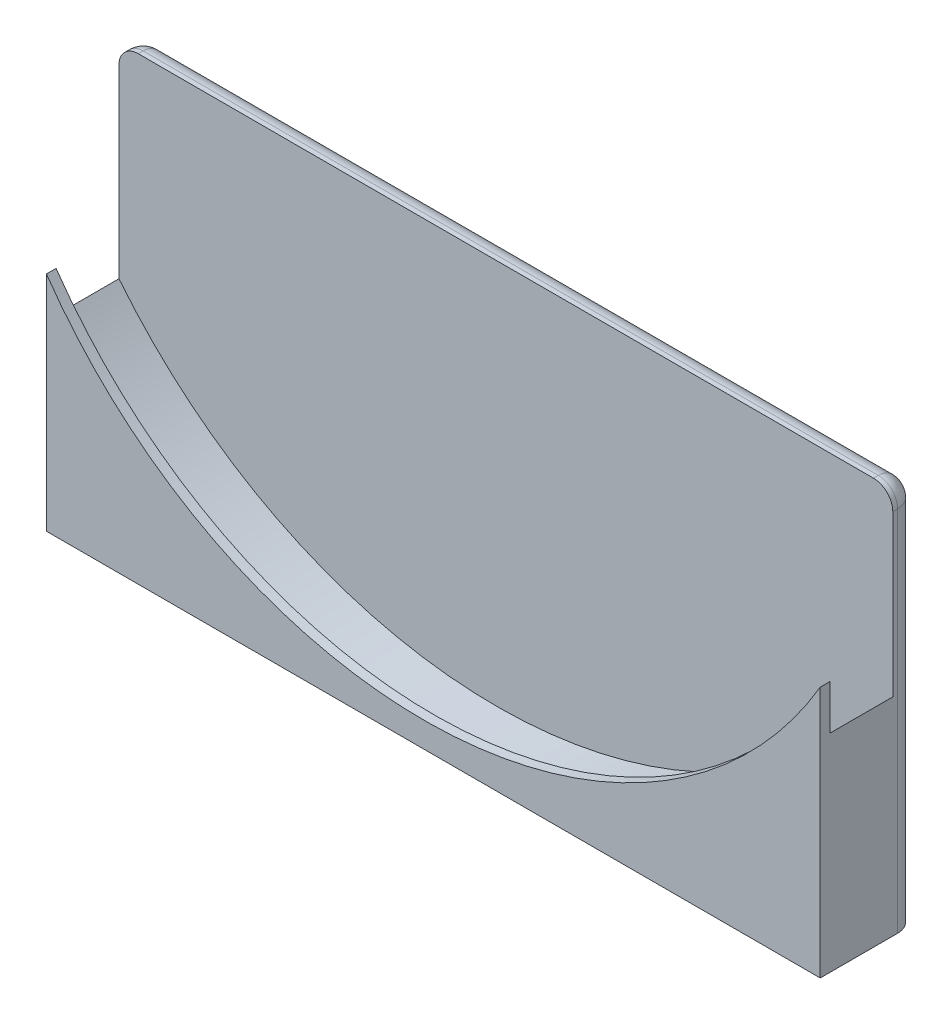
ISO-10303-21;
HEADER;
FILE_DESCRIPTION(('STEP AP214'),'2;1');
FILE_NAME('part.step','',(''),(''),'','','');
FILE_SCHEMA(('AUTOMOTIVE_DESIGN { 1 0 10303 214 1 1 1 1 }'));
ENDSEC;
DATA;
#1=APPLICATION_CONTEXT('core data for automotive mechanical design processes');
#2=APPLICATION_PROTOCOL_DEFINITION('international standard','automotive_design',2000,#1);
#3=PRODUCT_CONTEXT('',#1,'mechanical');
#4=PRODUCT('Part','Part','',(#3));
#5=PRODUCT_RELATED_PRODUCT_CATEGORY('part','',(#4));
#6=PRODUCT_DEFINITION_FORMATION('','',#4);
#7=PRODUCT_DEFINITION_CONTEXT('part definition',#1,'design');
#8=PRODUCT_DEFINITION('design','',#6,#7);
#9=PRODUCT_DEFINITION_SHAPE('','',#8);
#10=(LENGTH_UNIT() NAMED_UNIT(*) SI_UNIT(.MILLI.,.METRE.));
#11=(NAMED_UNIT(*) PLANE_ANGLE_UNIT() SI_UNIT($,.RADIAN.));
#12=(NAMED_UNIT(*) SI_UNIT($,.STERADIAN.) SOLID_ANGLE_UNIT());
#13=UNCERTAINTY_MEASURE_WITH_UNIT(LENGTH_MEASURE(1.E-05),#10,'distance_accuracy_value','');
#14=(GEOMETRIC_REPRESENTATION_CONTEXT(3) GLOBAL_UNCERTAINTY_ASSIGNED_CONTEXT((#13)) GLOBAL_UNIT_ASSIGNED_CONTEXT((#10,
#11,#12)) REPRESENTATION_CONTEXT('',''));
#15=CARTESIAN_POINT('',(0.,0.,0.));
#16=DIRECTION('',(0.,0.,1.));
#17=DIRECTION('',(1.,0.,0.));
#18=AXIS2_PLACEMENT_3D('',#15,#16,#17);
#19=CARTESIAN_POINT('',(0.,40.,0.));
#20=DIRECTION('',(0.,1.,0.));
#21=DIRECTION('',(0.,0.,1.));
#22=AXIS2_PLACEMENT_3D('',#19,#20,#21);
#23=PLANE('',#22);
#24=DIRECTION('',(0.,0.,-1.));
#25=VECTOR('',#24,1.);
#26=CARTESIAN_POINT('',(35.3343488695988,40.,2.06444673782802));
#27=LINE('',#26,#25);
#28=CARTESIAN_POINT('',(35.3343488695988,40.,4.56444673782803));
#29=VERTEX_POINT('',#28);
#30=CARTESIAN_POINT('',(35.3343488695988,40.,4.06444673782802));
#31=VERTEX_POINT('',#30);
#32=EDGE_CURVE('E188',#29,#31,#27,.T.);
#33=ORIENTED_EDGE('',*,*,#32,.T.);
#34=DIRECTION('',(-1.,0.,0.));
#35=VECTOR('',#34,1.);
#36=CARTESIAN_POINT('',(-40.6656511304012,40.,4.06444673782803));
#37=LINE('',#36,#35);
#38=CARTESIAN_POINT('',(-40.6656511304012,40.,4.06444673782803));
#39=VERTEX_POINT('',#38);
#40=EDGE_CURVE('E213',#31,#39,#37,.T.);
#41=ORIENTED_EDGE('',*,*,#40,.T.);
#42=DIRECTION('',(0.,0.,1.));
#43=VECTOR('',#42,1.);
#44=CARTESIAN_POINT('',(-40.6656511304012,40.,4.56444673782803));
#45=LINE('',#44,#43);
#46=CARTESIAN_POINT('',(-40.6656511304012,40.,4.56444673782803));
#47=VERTEX_POINT('',#46);
#48=EDGE_CURVE('E186',#39,#47,#45,.T.);
#49=ORIENTED_EDGE('',*,*,#48,.T.);
#50=DIRECTION('',(1.,0.,0.));
#51=VECTOR('',#50,1.);
#52=CARTESIAN_POINT('',(0.,40.,4.56444673782803));
#53=LINE('',#52,#51);
#54=EDGE_CURVE('E178',#47,#29,#53,.T.);
#55=ORIENTED_EDGE('',*,*,#54,.T.);
#56=EDGE_LOOP('',(#33,#41,#49,#55));
#57=FACE_BOUND('',#56,.T.);
#58=ADVANCED_FACE('F35',(#57),#23,.T.);
#59=CARTESIAN_POINT('',(37.3343488695988,40.,12.064446737828));
#60=DIRECTION('',(-1.,0.,0.));
#61=DIRECTION('',(0.,0.,1.));
#62=AXIS2_PLACEMENT_3D('',#59,#60,#61);
#63=PLANE('',#62);
#64=DIRECTION('',(0.,0.,-1.));
#65=VECTOR('',#64,1.);
#66=CARTESIAN_POINT('',(37.3343488695988,0.,12.064446737828));
#67=LINE('',#66,#65);
#68=CARTESIAN_POINT('',(37.3343488695988,0.,12.064446737828));
#69=VERTEX_POINT('',#68);
#70=CARTESIAN_POINT('',(37.3343488695988,0.,4.06444673782802));
#71=VERTEX_POINT('',#70);
#72=EDGE_CURVE('E163',#69,#71,#67,.T.);
#73=ORIENTED_EDGE('',*,*,#72,.T.);
#74=DIRECTION('',(0.,-1.,0.));
#75=VECTOR('',#74,1.);
#76=CARTESIAN_POINT('',(37.3343488695988,40.,4.06444673782802));
#77=LINE('',#76,#75);
#78=CARTESIAN_POINT('',(37.3343488695988,38.,4.06444673782802));
#79=VERTEX_POINT('',#78);
#80=EDGE_CURVE('E11',#71,#79,#77,.F.);
#81=ORIENTED_EDGE('',*,*,#80,.T.);
#82=DIRECTION('',(0.,0.,-1.));
#83=VECTOR('',#82,1.);
#84=CARTESIAN_POINT('',(37.3343488695988,38.,4.56444673782803));
#85=LINE('',#84,#83);
#86=CARTESIAN_POINT('',(37.3343488695988,38.,4.56444673782803));
#87=VERTEX_POINT('',#86);
#88=EDGE_CURVE('E129',#79,#87,#85,.F.);
#89=ORIENTED_EDGE('',*,*,#88,.T.);
#90=DIRECTION('',(0.,1.,0.));
#91=VECTOR('',#90,1.);
#92=CARTESIAN_POINT('',(37.3343488695988,40.,4.56444673782803));
#93=LINE('',#92,#91);
#94=CARTESIAN_POINT('',(37.3343488695988,21.4175759211361,4.56444673782802));
#95=VERTEX_POINT('',#94);
#96=EDGE_CURVE('E124',#95,#87,#93,.T.);
#97=ORIENTED_EDGE('',*,*,#96,.F.);
#98=DIRECTION('',(0.,0.,1.));
#99=VECTOR('',#98,1.);
#100=CARTESIAN_POINT('',(37.3343488695988,21.4175759211361,-136.856909499481));
#101=LINE('',#100,#99);
#102=CARTESIAN_POINT('',(37.3343488695988,21.4175759211361,11.064446737828));
#103=VERTEX_POINT('',#102);
#104=EDGE_CURVE('E128',#95,#103,#101,.T.);
#105=ORIENTED_EDGE('',*,*,#104,.T.);
#106=DIRECTION('',(0.,1.,0.));
#107=VECTOR('',#106,1.);
#108=CARTESIAN_POINT('',(37.3343488695988,40.,11.064446737828));
#109=LINE('',#108,#107);
#110=CARTESIAN_POINT('',(37.3343488695988,26.0401927177059,11.064446737828));
#111=VERTEX_POINT('',#110);
#112=EDGE_CURVE('E145',#103,#111,#109,.T.);
#113=ORIENTED_EDGE('',*,*,#112,.T.);
#114=DIRECTION('',(0.,0.,1.));
#115=VECTOR('',#114,1.);
#116=CARTESIAN_POINT('',(37.3343488695988,26.0401927177059,4.56444673782803));
#117=LINE('',#116,#115);
#118=CARTESIAN_POINT('',(37.3343488695988,26.0401927177059,12.064446737828));
#119=VERTEX_POINT('',#118);
#120=EDGE_CURVE('E161',#111,#119,#117,.T.);
#121=ORIENTED_EDGE('',*,*,#120,.T.);
#122=DIRECTION('',(0.,-1.,0.));
#123=VECTOR('',#122,1.);
#124=CARTESIAN_POINT('',(37.3343488695988,40.,12.064446737828));
#125=LINE('',#124,#123);
#126=EDGE_CURVE('E173',#119,#69,#125,.T.);
#127=ORIENTED_EDGE('',*,*,#126,.T.);
#128=EDGE_LOOP('',(#73,#81,#89,#97,#105,#113,#121,#127));
#129=FACE_BOUND('',#128,.T.);
#130=ADVANCED_FACE('F126',(#129),#63,.F.);
#131=CARTESIAN_POINT('',(37.3343488695988,40.,2.06444673782802));
#132=DIRECTION('',(0.,0.,1.));
#133=DIRECTION('',(1.,0.,0.));
#134=AXIS2_PLACEMENT_3D('',#131,#132,#133);
#135=PLANE('',#134);
#136=DIRECTION('',(-1.,0.,0.));
#137=VECTOR('',#136,1.);
#138=CARTESIAN_POINT('',(37.3343488695988,0.,2.06444673782802));
#139=LINE('',#138,#137);
#140=CARTESIAN_POINT('',(35.3343488695988,0.,2.06444673782802));
#141=VERTEX_POINT('',#140);
#142=CARTESIAN_POINT('',(-40.6656511304012,0.,2.06444673782803));
#143=VERTEX_POINT('',#142);
#144=EDGE_CURVE('E165',#141,#143,#139,.T.);
#145=ORIENTED_EDGE('',*,*,#144,.T.);
#146=DIRECTION('',(0.,-1.,0.));
#147=VECTOR('',#146,1.);
#148=CARTESIAN_POINT('',(-40.6656511304012,40.,2.06444673782803));
#149=LINE('',#148,#147);
#150=CARTESIAN_POINT('',(-40.6656511304012,38.,2.06444673782803));
#151=VERTEX_POINT('',#150);
#152=EDGE_CURVE('E209',#143,#151,#149,.F.);
#153=ORIENTED_EDGE('',*,*,#152,.T.);
#154=DIRECTION('',(-1.,0.,0.));
#155=VECTOR('',#154,1.);
#156=CARTESIAN_POINT('',(35.3343488695988,38.,2.06444673782802));
#157=LINE('',#156,#155);
#158=CARTESIAN_POINT('',(35.3343488695988,38.,2.06444673782802));
#159=VERTEX_POINT('',#158);
#160=EDGE_CURVE('E207',#151,#159,#157,.F.);
#161=ORIENTED_EDGE('',*,*,#160,.T.);
#162=DIRECTION('',(0.,-1.,0.));
#163=VECTOR('',#162,1.);
#164=CARTESIAN_POINT('',(35.3343488695988,40.,2.06444673782802));
#165=LINE('',#164,#163);
#166=EDGE_CURVE('E205',#159,#141,#165,.T.);
#167=ORIENTED_EDGE('',*,*,#166,.T.);
#168=EDGE_LOOP('',(#145,#153,#161,#167));
#169=FACE_BOUND('',#168,.T.);
#170=ADVANCED_FACE('F236',(#169),#135,.F.);
#171=CARTESIAN_POINT('',(-42.6656511304012,40.,12.064446737828));
#172=DIRECTION('',(1.,0.,0.));
#173=DIRECTION('',(0.,0.,-1.));
#174=AXIS2_PLACEMENT_3D('',#171,#172,#173);
#175=PLANE('',#174);
#176=DIRECTION('',(0.,0.,1.));
#177=VECTOR('',#176,1.);
#178=CARTESIAN_POINT('',(-42.6656511304012,38.,2.06444673782803));
#179=LINE('',#178,#177);
#180=CARTESIAN_POINT('',(-42.6656511304012,38.,4.56444673782803));
#181=VERTEX_POINT('',#180);
#182=CARTESIAN_POINT('',(-42.6656511304012,38.,4.06444673782803));
#183=VERTEX_POINT('',#182);
#184=EDGE_CURVE('E195',#181,#183,#179,.F.);
#185=ORIENTED_EDGE('',*,*,#184,.T.);
#186=DIRECTION('',(0.,-1.,0.));
#187=VECTOR('',#186,1.);
#188=CARTESIAN_POINT('',(-42.6656511304012,40.,4.06444673782803));
#189=LINE('',#188,#187);
#190=CARTESIAN_POINT('',(-42.6656511304012,0.,4.06444673782803));
#191=VERTEX_POINT('',#190);
#192=EDGE_CURVE('E198',#183,#191,#189,.T.);
#193=ORIENTED_EDGE('',*,*,#192,.T.);
#194=DIRECTION('',(0.,0.,1.));
#195=VECTOR('',#194,1.);
#196=CARTESIAN_POINT('',(-42.6656511304012,0.,12.064446737828));
#197=LINE('',#196,#195);
#198=CARTESIAN_POINT('',(-42.6656511304012,0.,12.064446737828));
#199=VERTEX_POINT('',#198);
#200=EDGE_CURVE('E168',#191,#199,#197,.T.);
#201=ORIENTED_EDGE('',*,*,#200,.T.);
#202=DIRECTION('',(0.,-1.,0.));
#203=VECTOR('',#202,1.);
#204=CARTESIAN_POINT('',(-42.6656511304012,40.,12.064446737828));
#205=LINE('',#204,#203);
#206=CARTESIAN_POINT('',(-42.6656511304012,23.0368066253289,12.064446737828));
#207=VERTEX_POINT('',#206);
#208=EDGE_CURVE('E175',#207,#199,#205,.T.);
#209=ORIENTED_EDGE('',*,*,#208,.F.);
#210=DIRECTION('',(0.,0.,1.));
#211=VECTOR('',#210,1.);
#212=CARTESIAN_POINT('',(-42.6656511304012,23.0368066253289,4.56444673782803));
#213=LINE('',#212,#211);
#214=CARTESIAN_POINT('',(-42.6656511304012,23.0368066253289,11.064446737828));
#215=VERTEX_POINT('',#214);
#216=EDGE_CURVE('E133',#207,#215,#213,.F.);
#217=ORIENTED_EDGE('',*,*,#216,.T.);
#218=DIRECTION('',(0.,-1.,0.));
#219=VECTOR('',#218,1.);
#220=CARTESIAN_POINT('',(-42.6656511304012,40.,11.064446737828));
#221=LINE('',#220,#219);
#222=CARTESIAN_POINT('',(-42.6656511304012,18.8555107813657,11.064446737828));
#223=VERTEX_POINT('',#222);
#224=EDGE_CURVE('E149',#215,#223,#221,.T.);
#225=ORIENTED_EDGE('',*,*,#224,.T.);
#226=DIRECTION('',(0.,0.,1.));
#227=VECTOR('',#226,1.);
#228=CARTESIAN_POINT('',(-42.6656511304012,18.8555107813657,-136.856909499481));
#229=LINE('',#228,#227);
#230=CARTESIAN_POINT('',(-42.6656511304012,18.8555107813657,4.56444673782802));
#231=VERTEX_POINT('',#230);
#232=EDGE_CURVE('E184',#223,#231,#229,.F.);
#233=ORIENTED_EDGE('',*,*,#232,.T.);
#234=DIRECTION('',(0.,-1.,0.));
#235=VECTOR('',#234,1.);
#236=CARTESIAN_POINT('',(-42.6656511304012,40.,4.56444673782803));
#237=LINE('',#236,#235);
#238=EDGE_CURVE('E134',#181,#231,#237,.T.);
#239=ORIENTED_EDGE('',*,*,#238,.F.);
#240=EDGE_LOOP('',(#185,#193,#201,#209,#217,#225,#233,#239));
#241=FACE_BOUND('',#240,.T.);
#242=ADVANCED_FACE('F247',(#241),#175,.F.);
#243=CARTESIAN_POINT('',(37.3343488695988,40.,12.064446737828));
#244=DIRECTION('',(0.,0.,-1.));
#245=DIRECTION('',(-1.,0.,0.));
#246=AXIS2_PLACEMENT_3D('',#243,#244,#245);
#247=PLANE('',#246);
#248=ORIENTED_EDGE('',*,*,#126,.F.);
#249=CARTESIAN_POINT('',(-3.62505734568685,50.0938211860102,12.064446737828));
#250=DIRECTION('',(0.,0.,1.));
#251=DIRECTION('',(1.,0.,0.));
#252=AXIS2_PLACEMENT_3D('',#249,#250,#251);
#253=CIRCLE('',#252,47.5);
#254=EDGE_CURVE('E144',#207,#119,#253,.T.);
#255=ORIENTED_EDGE('',*,*,#254,.F.);
#256=ORIENTED_EDGE('',*,*,#208,.T.);
#257=DIRECTION('',(1.,0.,0.));
#258=VECTOR('',#257,1.);
#259=CARTESIAN_POINT('',(37.3343488695988,0.,12.064446737828));
#260=LINE('',#259,#258);
#261=EDGE_CURVE('E170',#199,#69,#260,.T.);
#262=ORIENTED_EDGE('',*,*,#261,.T.);
#263=EDGE_LOOP('',(#248,#255,#256,#262));
#264=FACE_BOUND('',#263,.T.);
#265=ADVANCED_FACE('F285',(#264),#247,.F.);
#266=CARTESIAN_POINT('',(0.,0.,0.));
#267=DIRECTION('',(0.,1.,0.));
#268=DIRECTION('',(0.,0.,1.));
#269=AXIS2_PLACEMENT_3D('',#266,#267,#268);
#270=PLANE('',#269);
#271=ORIENTED_EDGE('',*,*,#200,.F.);
#272=CARTESIAN_POINT('',(-40.6656511304012,0.,4.06444673782803));
#273=DIRECTION('',(0.,1.,0.));
#274=DIRECTION('',(0.,0.,1.));
#275=AXIS2_PLACEMENT_3D('',#272,#273,#274);
#276=CIRCLE('',#275,2.);
#277=EDGE_CURVE('E203',#191,#143,#276,.F.);
#278=ORIENTED_EDGE('',*,*,#277,.T.);
#279=ORIENTED_EDGE('',*,*,#144,.F.);
#280=CARTESIAN_POINT('',(35.3343488695988,0.,4.06444673782802));
#281=DIRECTION('',(0.,1.,0.));
#282=DIRECTION('',(0.,0.,1.));
#283=AXIS2_PLACEMENT_3D('',#280,#281,#282);
#284=CIRCLE('',#283,2.);
#285=EDGE_CURVE('E201',#141,#71,#284,.F.);
#286=ORIENTED_EDGE('',*,*,#285,.T.);
#287=ORIENTED_EDGE('',*,*,#72,.F.);
#288=ORIENTED_EDGE('',*,*,#261,.F.);
#289=EDGE_LOOP('',(#271,#278,#279,#286,#287,#288));
#290=FACE_BOUND('',#289,.T.);
#291=ADVANCED_FACE('F240',(#290),#270,.F.);
#292=CARTESIAN_POINT('',(-3.62505734568685,50.0938211860102,4.56444673782803));
#293=DIRECTION('',(0.,0.,1.));
#294=DIRECTION('',(1.,0.,0.));
#295=AXIS2_PLACEMENT_3D('',#292,#293,#294);
#296=CYLINDRICAL_SURFACE('',#295,47.5);
#297=ORIENTED_EDGE('',*,*,#120,.F.);
#298=CARTESIAN_POINT('',(-3.62505734568685,50.0938211860102,11.064446737828));
#299=DIRECTION('',(0.,0.,1.));
#300=DIRECTION('',(1.,0.,0.));
#301=AXIS2_PLACEMENT_3D('',#298,#299,#300);
#302=CIRCLE('',#301,47.5);
#303=EDGE_CURVE('E181',#111,#215,#302,.F.);
#304=ORIENTED_EDGE('',*,*,#303,.T.);
#305=ORIENTED_EDGE('',*,*,#216,.F.);
#306=ORIENTED_EDGE('',*,*,#254,.T.);
#307=EDGE_LOOP('',(#297,#304,#305,#306));
#308=FACE_BOUND('',#307,.T.);
#309=ADVANCED_FACE('F281',(#308),#296,.F.);
#310=CARTESIAN_POINT('',(-3.62505734568685,50.0938211860102,4.56444673782803));
#311=DIRECTION('',(0.,0.,1.));
#312=DIRECTION('',(1.,0.,0.));
#313=AXIS2_PLACEMENT_3D('',#310,#311,#312);
#314=PLANE('',#313);
#315=ORIENTED_EDGE('',*,*,#96,.T.);
#316=CARTESIAN_POINT('',(35.3343488695988,38.,4.56444673782803));
#317=DIRECTION('',(0.,0.,1.));
#318=DIRECTION('',(1.,0.,0.));
#319=AXIS2_PLACEMENT_3D('',#316,#317,#318);
#320=CIRCLE('',#319,2.);
#321=EDGE_CURVE('E193',#87,#29,#320,.T.);
#322=ORIENTED_EDGE('',*,*,#321,.T.);
#323=ORIENTED_EDGE('',*,*,#54,.F.);
#324=CARTESIAN_POINT('',(-40.6656511304012,38.,4.56444673782803));
#325=DIRECTION('',(0.,0.,1.));
#326=DIRECTION('',(1.,0.,0.));
#327=AXIS2_PLACEMENT_3D('',#324,#325,#326);
#328=CIRCLE('',#327,2.);
#329=EDGE_CURVE('E191',#47,#181,#328,.T.);
#330=ORIENTED_EDGE('',*,*,#329,.T.);
#331=ORIENTED_EDGE('',*,*,#238,.T.);
#332=CARTESIAN_POINT('',(-3.62505734568685,50.0938211860102,4.56444673782802));
#333=DIRECTION('',(0.,0.,1.));
#334=DIRECTION('',(1.,0.,0.));
#335=AXIS2_PLACEMENT_3D('',#332,#333,#334);
#336=CIRCLE('',#335,50.);
#337=EDGE_CURVE('E140',#95,#231,#336,.F.);
#338=ORIENTED_EDGE('',*,*,#337,.F.);
#339=EDGE_LOOP('',(#315,#322,#323,#330,#331,#338));
#340=FACE_BOUND('',#339,.T.);
#341=ADVANCED_FACE('F147',(#340),#314,.T.);
#342=CARTESIAN_POINT('',(-3.62505734568685,50.0938211860102,-136.856909499481));
#343=DIRECTION('',(0.,0.,1.));
#344=DIRECTION('',(1.,0.,0.));
#345=AXIS2_PLACEMENT_3D('',#342,#343,#344);
#346=CYLINDRICAL_SURFACE('',#345,50.);
#347=ORIENTED_EDGE('',*,*,#337,.T.);
#348=ORIENTED_EDGE('',*,*,#232,.F.);
#349=CARTESIAN_POINT('',(-3.62505734568685,50.0938211860102,11.064446737828));
#350=DIRECTION('',(0.,0.,1.));
#351=DIRECTION('',(1.,0.,0.));
#352=AXIS2_PLACEMENT_3D('',#349,#350,#351);
#353=CIRCLE('',#352,50.);
#354=EDGE_CURVE('E143',#223,#103,#353,.T.);
#355=ORIENTED_EDGE('',*,*,#354,.T.);
#356=ORIENTED_EDGE('',*,*,#104,.F.);
#357=EDGE_LOOP('',(#347,#348,#355,#356));
#358=FACE_BOUND('',#357,.T.);
#359=ADVANCED_FACE('F139',(#358),#346,.F.);
#360=CARTESIAN_POINT('',(-3.62505734568685,50.0938211860102,11.064446737828));
#361=DIRECTION('',(0.,0.,1.));
#362=DIRECTION('',(1.,0.,0.));
#363=AXIS2_PLACEMENT_3D('',#360,#361,#362);
#364=PLANE('',#363);
#365=ORIENTED_EDGE('',*,*,#354,.F.);
#366=ORIENTED_EDGE('',*,*,#224,.F.);
#367=ORIENTED_EDGE('',*,*,#303,.F.);
#368=ORIENTED_EDGE('',*,*,#112,.F.);
#369=EDGE_LOOP('',(#365,#366,#367,#368));
#370=FACE_BOUND('',#369,.T.);
#371=ADVANCED_FACE('F264',(#370),#364,.F.);
#372=CARTESIAN_POINT('',(35.3343488695988,38.,0.));
#373=DIRECTION('',(0.,0.,1.));
#374=DIRECTION('',(1.,0.,0.));
#375=AXIS2_PLACEMENT_3D('',#372,#373,#374);
#376=CYLINDRICAL_SURFACE('',#375,2.);
#377=ORIENTED_EDGE('',*,*,#88,.F.);
#378=CARTESIAN_POINT('',(35.3343488695988,38.,4.06444673782802));
#379=DIRECTION('',(0.,0.,1.));
#380=DIRECTION('',(1.,0.,0.));
#381=AXIS2_PLACEMENT_3D('',#378,#379,#380);
#382=CIRCLE('',#381,2.);
#383=EDGE_CURVE('E44',#79,#31,#382,.T.);
#384=ORIENTED_EDGE('',*,*,#383,.T.);
#385=ORIENTED_EDGE('',*,*,#32,.F.);
#386=ORIENTED_EDGE('',*,*,#321,.F.);
#387=EDGE_LOOP('',(#377,#384,#385,#386));
#388=FACE_BOUND('',#387,.T.);
#389=ADVANCED_FACE('F262',(#388),#376,.T.);
#390=CARTESIAN_POINT('',(-40.6656511304012,38.,0.));
#391=DIRECTION('',(0.,0.,-1.));
#392=DIRECTION('',(-1.,0.,0.));
#393=AXIS2_PLACEMENT_3D('',#390,#391,#392);
#394=CYLINDRICAL_SURFACE('',#393,2.);
#395=ORIENTED_EDGE('',*,*,#48,.F.);
#396=CARTESIAN_POINT('',(-40.6656511304012,38.,4.06444673782803));
#397=DIRECTION('',(0.,0.,-1.));
#398=DIRECTION('',(-1.,0.,0.));
#399=AXIS2_PLACEMENT_3D('',#396,#397,#398);
#400=CIRCLE('',#399,2.);
#401=EDGE_CURVE('E211',#39,#183,#400,.F.);
#402=ORIENTED_EDGE('',*,*,#401,.T.);
#403=ORIENTED_EDGE('',*,*,#184,.F.);
#404=ORIENTED_EDGE('',*,*,#329,.F.);
#405=EDGE_LOOP('',(#395,#402,#403,#404));
#406=FACE_BOUND('',#405,.T.);
#407=ADVANCED_FACE('F260',(#406),#394,.T.);
#408=CARTESIAN_POINT('',(35.3343488695988,40.,4.06444673782802));
#409=DIRECTION('',(0.,-1.,0.));
#410=DIRECTION('',(0.,0.,-1.));
#411=AXIS2_PLACEMENT_3D('',#408,#409,#410);
#412=CYLINDRICAL_SURFACE('',#411,2.);
#413=CARTESIAN_POINT('',(35.3343488695988,38.,4.06444673782802));
#414=DIRECTION('',(0.,1.,0.));
#415=DIRECTION('',(0.,0.,1.));
#416=AXIS2_PLACEMENT_3D('',#413,#414,#415);
#417=CIRCLE('',#416,2.);
#418=EDGE_CURVE('E39',#79,#159,#417,.T.);
#419=ORIENTED_EDGE('',*,*,#418,.F.);
#420=ORIENTED_EDGE('',*,*,#80,.F.);
#421=ORIENTED_EDGE('',*,*,#285,.F.);
#422=ORIENTED_EDGE('',*,*,#166,.F.);
#423=EDGE_LOOP('',(#419,#420,#421,#422));
#424=FACE_BOUND('',#423,.T.);
#425=ADVANCED_FACE('F37',(#424),#412,.T.);
#426=CARTESIAN_POINT('',(35.3343488695988,38.,4.06444673782802));
#427=DIRECTION('',(0.,0.,1.));
#428=DIRECTION('',(1.,0.,0.));
#429=AXIS2_PLACEMENT_3D('',#426,#427,#428);
#430=SPHERICAL_SURFACE('',#429,2.);
#431=ORIENTED_EDGE('',*,*,#383,.F.);
#432=ORIENTED_EDGE('',*,*,#418,.T.);
#433=CARTESIAN_POINT('',(35.3343488695988,38.,4.06444673782802));
#434=DIRECTION('',(-1.,0.,0.));
#435=DIRECTION('',(0.,0.,1.));
#436=AXIS2_PLACEMENT_3D('',#433,#434,#435);
#437=CIRCLE('',#436,2.);
#438=EDGE_CURVE('E221',#31,#159,#437,.T.);
#439=ORIENTED_EDGE('',*,*,#438,.F.);
#440=EDGE_LOOP('',(#431,#432,#439));
#441=FACE_BOUND('',#440,.T.);
#442=ADVANCED_FACE('F230',(#441),#430,.T.);
#443=CARTESIAN_POINT('',(0.,38.,4.06444673782803));
#444=DIRECTION('',(1.,0.,0.));
#445=DIRECTION('',(0.,0.,-1.));
#446=AXIS2_PLACEMENT_3D('',#443,#444,#445);
#447=CYLINDRICAL_SURFACE('',#446,2.);
#448=CARTESIAN_POINT('',(-40.6656511304012,38.,4.06444673782803));
#449=DIRECTION('',(-1.,0.,0.));
#450=DIRECTION('',(0.,0.,1.));
#451=AXIS2_PLACEMENT_3D('',#448,#449,#450);
#452=CIRCLE('',#451,2.);
#453=EDGE_CURVE('E219',#39,#151,#452,.T.);
#454=ORIENTED_EDGE('',*,*,#453,.F.);
#455=ORIENTED_EDGE('',*,*,#40,.F.);
#456=ORIENTED_EDGE('',*,*,#438,.T.);
#457=ORIENTED_EDGE('',*,*,#160,.F.);
#458=EDGE_LOOP('',(#454,#455,#456,#457));
#459=FACE_BOUND('',#458,.T.);
#460=ADVANCED_FACE('F257',(#459),#447,.T.);
#461=CARTESIAN_POINT('',(-40.6656511304012,38.,4.06444673782803));
#462=DIRECTION('',(0.,0.,1.));
#463=DIRECTION('',(1.,0.,0.));
#464=AXIS2_PLACEMENT_3D('',#461,#462,#463);
#465=SPHERICAL_SURFACE('',#464,2.);
#466=ORIENTED_EDGE('',*,*,#401,.F.);
#467=ORIENTED_EDGE('',*,*,#453,.T.);
#468=CARTESIAN_POINT('',(-40.6656511304012,38.,4.06444673782803));
#469=DIRECTION('',(0.,-1.,0.));
#470=DIRECTION('',(0.,0.,-1.));
#471=AXIS2_PLACEMENT_3D('',#468,#469,#470);
#472=CIRCLE('',#471,2.);
#473=EDGE_CURVE('E216',#183,#151,#472,.T.);
#474=ORIENTED_EDGE('',*,*,#473,.F.);
#475=EDGE_LOOP('',(#466,#467,#474));
#476=FACE_BOUND('',#475,.T.);
#477=ADVANCED_FACE('F255',(#476),#465,.T.);
#478=CARTESIAN_POINT('',(-40.6656511304012,40.,4.06444673782803));
#479=DIRECTION('',(0.,-1.,0.));
#480=DIRECTION('',(0.,0.,-1.));
#481=AXIS2_PLACEMENT_3D('',#478,#479,#480);
#482=CYLINDRICAL_SURFACE('',#481,2.);
#483=ORIENTED_EDGE('',*,*,#473,.T.);
#484=ORIENTED_EDGE('',*,*,#152,.F.);
#485=ORIENTED_EDGE('',*,*,#277,.F.);
#486=ORIENTED_EDGE('',*,*,#192,.F.);
#487=EDGE_LOOP('',(#483,#484,#485,#486));
#488=FACE_BOUND('',#487,.T.);
#489=ADVANCED_FACE('F245',(#488),#482,.T.);
#490=CLOSED_SHELL('',(#58,#130,#170,#242,#265,#291,#309,#341,#359,#371,#389,#407,#425,#442,#460,
#477,#489));
#491=MANIFOLD_SOLID_BREP('B2',#490);
#492=ADVANCED_BREP_SHAPE_REPRESENTATION('',(#18,#491),#14);
#493=SHAPE_DEFINITION_REPRESENTATION(#9,#492);
ENDSEC;
END-ISO-10303-21;
